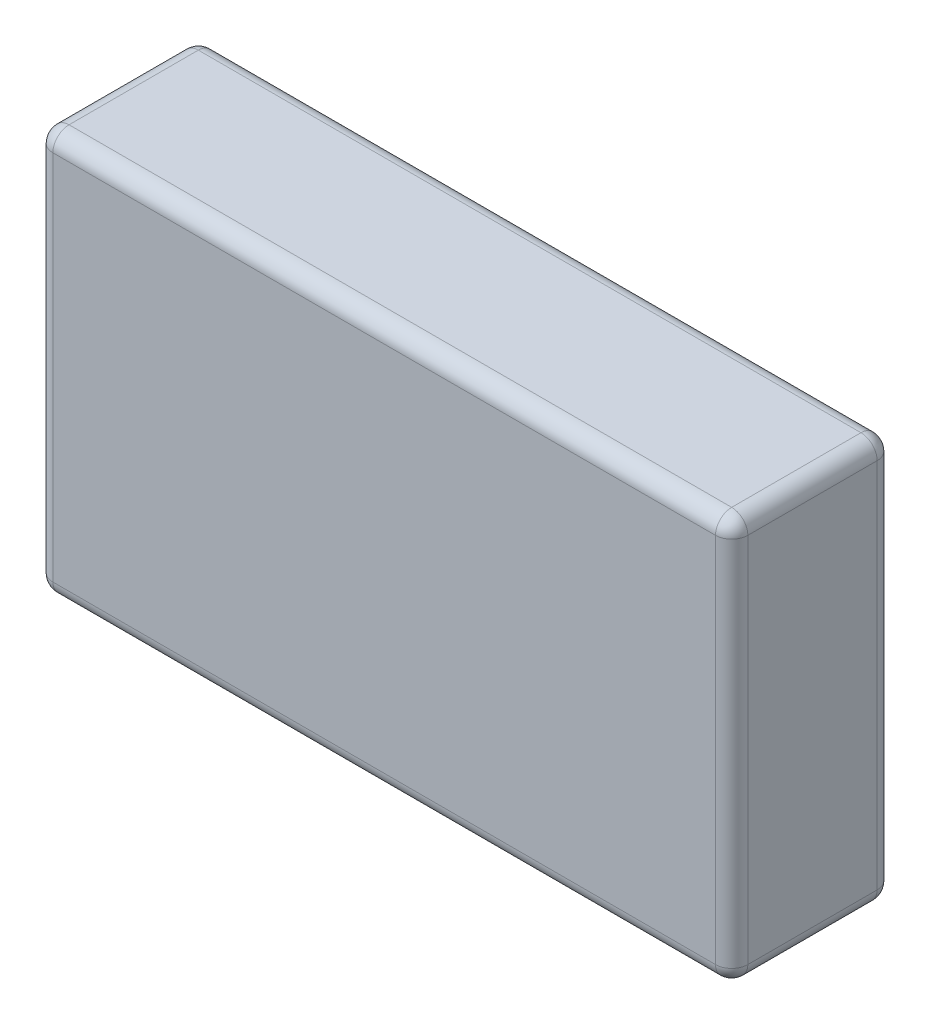
ISO-10303-21;
HEADER;
FILE_DESCRIPTION(('STEP AP214'),'2;1');
FILE_NAME('part.step','',(''),(''),'','','');
FILE_SCHEMA(('AUTOMOTIVE_DESIGN { 1 0 10303 214 1 1 1 1 }'));
ENDSEC;
DATA;
#1=APPLICATION_CONTEXT('core data for automotive mechanical design processes');
#2=APPLICATION_PROTOCOL_DEFINITION('international standard','automotive_design',2000,#1);
#3=PRODUCT_CONTEXT('',#1,'mechanical');
#4=PRODUCT('Part','Part','',(#3));
#5=PRODUCT_RELATED_PRODUCT_CATEGORY('part','',(#4));
#6=PRODUCT_DEFINITION_FORMATION('','',#4);
#7=PRODUCT_DEFINITION_CONTEXT('part definition',#1,'design');
#8=PRODUCT_DEFINITION('design','',#6,#7);
#9=PRODUCT_DEFINITION_SHAPE('','',#8);
#10=(LENGTH_UNIT() NAMED_UNIT(*) SI_UNIT(.MILLI.,.METRE.));
#11=(NAMED_UNIT(*) PLANE_ANGLE_UNIT() SI_UNIT($,.RADIAN.));
#12=(NAMED_UNIT(*) SI_UNIT($,.STERADIAN.) SOLID_ANGLE_UNIT());
#13=UNCERTAINTY_MEASURE_WITH_UNIT(LENGTH_MEASURE(1.E-05),#10,'distance_accuracy_value','');
#14=(GEOMETRIC_REPRESENTATION_CONTEXT(3) GLOBAL_UNCERTAINTY_ASSIGNED_CONTEXT((#13)) GLOBAL_UNIT_ASSIGNED_CONTEXT((#10,
#11,#12)) REPRESENTATION_CONTEXT('',''));
#15=CARTESIAN_POINT('',(0.,0.,0.));
#16=DIRECTION('',(0.,0.,1.));
#17=DIRECTION('',(1.,0.,0.));
#18=AXIS2_PLACEMENT_3D('',#15,#16,#17);
#19=CARTESIAN_POINT('',(21.5,-12.5,10.));
#20=DIRECTION('',(-1.,0.,0.));
#21=DIRECTION('',(0.,0.,1.));
#22=AXIS2_PLACEMENT_3D('',#19,#20,#21);
#23=PLANE('',#22);
#24=DIRECTION('',(0.,1.,0.));
#25=VECTOR('',#24,1.);
#26=CARTESIAN_POINT('',(21.5,12.5,0.999999999999999));
#27=LINE('',#26,#25);
#28=CARTESIAN_POINT('',(21.5,-11.5,0.999999999999999));
#29=VERTEX_POINT('',#28);
#30=CARTESIAN_POINT('',(21.5,11.5,0.999999999999999));
#31=VERTEX_POINT('',#30);
#32=EDGE_CURVE('E181',#29,#31,#27,.T.);
#33=ORIENTED_EDGE('',*,*,#32,.T.);
#34=DIRECTION('',(0.,0.,-1.));
#35=VECTOR('',#34,1.);
#36=CARTESIAN_POINT('',(21.5,11.5,10.));
#37=LINE('',#36,#35);
#38=CARTESIAN_POINT('',(21.5,11.5,9.));
#39=VERTEX_POINT('',#38);
#40=EDGE_CURVE('E183',#31,#39,#37,.F.);
#41=ORIENTED_EDGE('',*,*,#40,.T.);
#42=DIRECTION('',(0.,1.,0.));
#43=VECTOR('',#42,1.);
#44=CARTESIAN_POINT('',(21.5,-12.5,9.));
#45=LINE('',#44,#43);
#46=CARTESIAN_POINT('',(21.5,-11.5,9.));
#47=VERTEX_POINT('',#46);
#48=EDGE_CURVE('E177',#39,#47,#45,.F.);
#49=ORIENTED_EDGE('',*,*,#48,.T.);
#50=DIRECTION('',(0.,0.,-1.));
#51=VECTOR('',#50,1.);
#52=CARTESIAN_POINT('',(21.5,-11.5,10.));
#53=LINE('',#52,#51);
#54=EDGE_CURVE('E179',#47,#29,#53,.T.);
#55=ORIENTED_EDGE('',*,*,#54,.T.);
#56=EDGE_LOOP('',(#33,#41,#49,#55));
#57=FACE_BOUND('',#56,.T.);
#58=ADVANCED_FACE('F37',(#57),#23,.F.);
#59=CARTESIAN_POINT('',(-21.5,12.5,10.));
#60=DIRECTION('',(0.,-1.,0.));
#61=DIRECTION('',(0.,0.,-1.));
#62=AXIS2_PLACEMENT_3D('',#59,#60,#61);
#63=PLANE('',#62);
#64=DIRECTION('',(0.,0.,-1.));
#65=VECTOR('',#64,1.);
#66=CARTESIAN_POINT('',(20.5,12.5,10.));
#67=LINE('',#66,#65);
#68=CARTESIAN_POINT('',(20.5,12.5,9.));
#69=VERTEX_POINT('',#68);
#70=CARTESIAN_POINT('',(20.5,12.5,0.999999999999999));
#71=VERTEX_POINT('',#70);
#72=EDGE_CURVE('E170',#69,#71,#67,.T.);
#73=ORIENTED_EDGE('',*,*,#72,.T.);
#74=DIRECTION('',(-1.,0.,0.));
#75=VECTOR('',#74,1.);
#76=CARTESIAN_POINT('',(-21.5,12.5,0.999999999999999));
#77=LINE('',#76,#75);
#78=CARTESIAN_POINT('',(-20.5,12.5,0.999999999999999));
#79=VERTEX_POINT('',#78);
#80=EDGE_CURVE('E175',#71,#79,#77,.T.);
#81=ORIENTED_EDGE('',*,*,#80,.T.);
#82=DIRECTION('',(0.,0.,-1.));
#83=VECTOR('',#82,1.);
#84=CARTESIAN_POINT('',(-20.5,12.5,10.));
#85=LINE('',#84,#83);
#86=CARTESIAN_POINT('',(-20.5,12.5,9.));
#87=VERTEX_POINT('',#86);
#88=EDGE_CURVE('E172',#79,#87,#85,.F.);
#89=ORIENTED_EDGE('',*,*,#88,.T.);
#90=DIRECTION('',(-1.,0.,0.));
#91=VECTOR('',#90,1.);
#92=CARTESIAN_POINT('',(-21.5,12.5,9.));
#93=LINE('',#92,#91);
#94=EDGE_CURVE('E168',#87,#69,#93,.F.);
#95=ORIENTED_EDGE('',*,*,#94,.T.);
#96=EDGE_LOOP('',(#73,#81,#89,#95));
#97=FACE_BOUND('',#96,.T.);
#98=ADVANCED_FACE('F308',(#97),#63,.F.);
#99=CARTESIAN_POINT('',(-21.5,-12.5,10.));
#100=DIRECTION('',(1.,0.,0.));
#101=DIRECTION('',(0.,0.,-1.));
#102=AXIS2_PLACEMENT_3D('',#99,#100,#101);
#103=PLANE('',#102);
#104=DIRECTION('',(0.,-1.,0.));
#105=VECTOR('',#104,1.);
#106=CARTESIAN_POINT('',(-21.5,-12.5,9.));
#107=LINE('',#106,#105);
#108=CARTESIAN_POINT('',(-21.5,-11.5,9.));
#109=VERTEX_POINT('',#108);
#110=CARTESIAN_POINT('',(-21.5,11.5,9.));
#111=VERTEX_POINT('',#110);
#112=EDGE_CURVE('E129',#109,#111,#107,.F.);
#113=ORIENTED_EDGE('',*,*,#112,.T.);
#114=DIRECTION('',(0.,0.,-1.));
#115=VECTOR('',#114,1.);
#116=CARTESIAN_POINT('',(-21.5,11.5,10.));
#117=LINE('',#116,#115);
#118=CARTESIAN_POINT('',(-21.5,11.5,0.999999999999999));
#119=VERTEX_POINT('',#118);
#120=EDGE_CURVE('E166',#111,#119,#117,.T.);
#121=ORIENTED_EDGE('',*,*,#120,.T.);
#122=DIRECTION('',(0.,-1.,0.));
#123=VECTOR('',#122,1.);
#124=CARTESIAN_POINT('',(-21.5,-12.5,0.999999999999999));
#125=LINE('',#124,#123);
#126=CARTESIAN_POINT('',(-21.5,-11.5,0.999999999999999));
#127=VERTEX_POINT('',#126);
#128=EDGE_CURVE('E132',#119,#127,#125,.T.);
#129=ORIENTED_EDGE('',*,*,#128,.T.);
#130=DIRECTION('',(0.,0.,-1.));
#131=VECTOR('',#130,1.);
#132=CARTESIAN_POINT('',(-21.5,-11.5,10.));
#133=LINE('',#132,#131);
#134=EDGE_CURVE('E124',#127,#109,#133,.F.);
#135=ORIENTED_EDGE('',*,*,#134,.T.);
#136=EDGE_LOOP('',(#113,#121,#129,#135));
#137=FACE_BOUND('',#136,.T.);
#138=ADVANCED_FACE('F126',(#137),#103,.F.);
#139=CARTESIAN_POINT('',(-21.5,-12.5,10.));
#140=DIRECTION('',(0.,1.,0.));
#141=DIRECTION('',(0.,0.,1.));
#142=AXIS2_PLACEMENT_3D('',#139,#140,#141);
#143=PLANE('',#142);
#144=DIRECTION('',(0.,0.,-1.));
#145=VECTOR('',#144,1.);
#146=CARTESIAN_POINT('',(-20.5,-12.5,10.));
#147=LINE('',#146,#145);
#148=CARTESIAN_POINT('',(-20.5,-12.5,9.));
#149=VERTEX_POINT('',#148);
#150=CARTESIAN_POINT('',(-20.5,-12.5,0.999999999999999));
#151=VERTEX_POINT('',#150);
#152=EDGE_CURVE('E143',#149,#151,#147,.T.);
#153=ORIENTED_EDGE('',*,*,#152,.T.);
#154=DIRECTION('',(1.,0.,0.));
#155=VECTOR('',#154,1.);
#156=CARTESIAN_POINT('',(21.5,-12.5,0.999999999999999));
#157=LINE('',#156,#155);
#158=CARTESIAN_POINT('',(20.5,-12.5,0.999999999999999));
#159=VERTEX_POINT('',#158);
#160=EDGE_CURVE('E200',#151,#159,#157,.T.);
#161=ORIENTED_EDGE('',*,*,#160,.T.);
#162=DIRECTION('',(0.,0.,-1.));
#163=VECTOR('',#162,1.);
#164=CARTESIAN_POINT('',(20.5,-12.5,10.));
#165=LINE('',#164,#163);
#166=CARTESIAN_POINT('',(20.5,-12.5,9.));
#167=VERTEX_POINT('',#166);
#168=EDGE_CURVE('E197',#159,#167,#165,.F.);
#169=ORIENTED_EDGE('',*,*,#168,.T.);
#170=DIRECTION('',(1.,0.,0.));
#171=VECTOR('',#170,1.);
#172=CARTESIAN_POINT('',(-21.5,-12.5,9.));
#173=LINE('',#172,#171);
#174=EDGE_CURVE('E195',#167,#149,#173,.F.);
#175=ORIENTED_EDGE('',*,*,#174,.T.);
#176=EDGE_LOOP('',(#153,#161,#169,#175));
#177=FACE_BOUND('',#176,.T.);
#178=ADVANCED_FACE('F299',(#177),#143,.F.);
#179=CARTESIAN_POINT('',(0.,0.,10.));
#180=DIRECTION('',(0.,0.,-1.));
#181=DIRECTION('',(-1.,0.,0.));
#182=AXIS2_PLACEMENT_3D('',#179,#180,#181);
#183=PLANE('',#182);
#184=DIRECTION('',(0.,-1.,0.));
#185=VECTOR('',#184,1.);
#186=CARTESIAN_POINT('',(-20.5,0.,10.));
#187=LINE('',#186,#185);
#188=CARTESIAN_POINT('',(-20.5,11.5,10.));
#189=VERTEX_POINT('',#188);
#190=CARTESIAN_POINT('',(-20.5,-11.5,10.));
#191=VERTEX_POINT('',#190);
#192=EDGE_CURVE('E46',#189,#191,#187,.T.);
#193=ORIENTED_EDGE('',*,*,#192,.T.);
#194=DIRECTION('',(1.,0.,0.));
#195=VECTOR('',#194,1.);
#196=CARTESIAN_POINT('',(0.,-11.5,10.));
#197=LINE('',#196,#195);
#198=CARTESIAN_POINT('',(20.5,-11.5,10.));
#199=VERTEX_POINT('',#198);
#200=EDGE_CURVE('E11',#191,#199,#197,.T.);
#201=ORIENTED_EDGE('',*,*,#200,.T.);
#202=DIRECTION('',(0.,1.,0.));
#203=VECTOR('',#202,1.);
#204=CARTESIAN_POINT('',(20.5,0.,10.));
#205=LINE('',#204,#203);
#206=CARTESIAN_POINT('',(20.5,11.5,10.));
#207=VERTEX_POINT('',#206);
#208=EDGE_CURVE('E202',#199,#207,#205,.T.);
#209=ORIENTED_EDGE('',*,*,#208,.T.);
#210=DIRECTION('',(-1.,0.,0.));
#211=VECTOR('',#210,1.);
#212=CARTESIAN_POINT('',(0.,11.5,10.));
#213=LINE('',#212,#211);
#214=EDGE_CURVE('E57',#207,#189,#213,.T.);
#215=ORIENTED_EDGE('',*,*,#214,.T.);
#216=EDGE_LOOP('',(#193,#201,#209,#215));
#217=FACE_BOUND('',#216,.T.);
#218=ADVANCED_FACE('F301',(#217),#183,.F.);
#219=CARTESIAN_POINT('',(0.,0.,0.));
#220=DIRECTION('',(0.,0.,-1.));
#221=DIRECTION('',(-1.,0.,0.));
#222=AXIS2_PLACEMENT_3D('',#219,#220,#221);
#223=PLANE('',#222);
#224=DIRECTION('',(0.,-1.,0.));
#225=VECTOR('',#224,1.);
#226=CARTESIAN_POINT('',(-20.5,12.5,0.));
#227=LINE('',#226,#225);
#228=CARTESIAN_POINT('',(-20.5,-11.5,0.));
#229=VERTEX_POINT('',#228);
#230=CARTESIAN_POINT('',(-20.5,11.5,0.));
#231=VERTEX_POINT('',#230);
#232=EDGE_CURVE('E190',#229,#231,#227,.F.);
#233=ORIENTED_EDGE('',*,*,#232,.T.);
#234=DIRECTION('',(-1.,0.,0.));
#235=VECTOR('',#234,1.);
#236=CARTESIAN_POINT('',(21.5,11.5,0.));
#237=LINE('',#236,#235);
#238=CARTESIAN_POINT('',(20.5,11.5,0.));
#239=VERTEX_POINT('',#238);
#240=EDGE_CURVE('E192',#231,#239,#237,.F.);
#241=ORIENTED_EDGE('',*,*,#240,.T.);
#242=DIRECTION('',(0.,1.,0.));
#243=VECTOR('',#242,1.);
#244=CARTESIAN_POINT('',(20.5,-12.5,0.));
#245=LINE('',#244,#243);
#246=CARTESIAN_POINT('',(20.5,-11.5,0.));
#247=VERTEX_POINT('',#246);
#248=EDGE_CURVE('E188',#239,#247,#245,.F.);
#249=ORIENTED_EDGE('',*,*,#248,.T.);
#250=DIRECTION('',(1.,0.,0.));
#251=VECTOR('',#250,1.);
#252=CARTESIAN_POINT('',(-21.5,-11.5,0.));
#253=LINE('',#252,#251);
#254=EDGE_CURVE('E186',#247,#229,#253,.F.);
#255=ORIENTED_EDGE('',*,*,#254,.T.);
#256=EDGE_LOOP('',(#233,#241,#249,#255));
#257=FACE_BOUND('',#256,.T.);
#258=ADVANCED_FACE('F269',(#257),#223,.T.);
#259=CARTESIAN_POINT('',(20.5,-11.5,10.));
#260=DIRECTION('',(0.,0.,-1.));
#261=DIRECTION('',(-1.,0.,0.));
#262=AXIS2_PLACEMENT_3D('',#259,#260,#261);
#263=CYLINDRICAL_SURFACE('',#262,1.);
#264=CARTESIAN_POINT('',(20.5,-11.5,9.));
#265=DIRECTION('',(0.,0.,1.));
#266=DIRECTION('',(1.,0.,0.));
#267=AXIS2_PLACEMENT_3D('',#264,#265,#266);
#268=CIRCLE('',#267,1.);
#269=EDGE_CURVE('E41',#167,#47,#268,.T.);
#270=ORIENTED_EDGE('',*,*,#269,.F.);
#271=ORIENTED_EDGE('',*,*,#168,.F.);
#272=CARTESIAN_POINT('',(20.5,-11.5,0.999999999999999));
#273=DIRECTION('',(0.,0.,-1.));
#274=DIRECTION('',(-1.,0.,0.));
#275=AXIS2_PLACEMENT_3D('',#272,#273,#274);
#276=CIRCLE('',#275,1.);
#277=EDGE_CURVE('E163',#29,#159,#276,.T.);
#278=ORIENTED_EDGE('',*,*,#277,.F.);
#279=ORIENTED_EDGE('',*,*,#54,.F.);
#280=EDGE_LOOP('',(#270,#271,#278,#279));
#281=FACE_BOUND('',#280,.T.);
#282=ADVANCED_FACE('F39',(#281),#263,.T.);
#283=CARTESIAN_POINT('',(20.5,-11.5,9.));
#284=DIRECTION('',(0.,0.,1.));
#285=DIRECTION('',(1.,0.,0.));
#286=AXIS2_PLACEMENT_3D('',#283,#284,#285);
#287=SPHERICAL_SURFACE('',#286,1.);
#288=CARTESIAN_POINT('',(20.5,-11.5,9.));
#289=DIRECTION('',(1.,0.,0.));
#290=DIRECTION('',(0.,0.,-1.));
#291=AXIS2_PLACEMENT_3D('',#288,#289,#290);
#292=CIRCLE('',#291,1.);
#293=EDGE_CURVE('E247',#167,#199,#292,.F.);
#294=ORIENTED_EDGE('',*,*,#293,.F.);
#295=ORIENTED_EDGE('',*,*,#269,.T.);
#296=CARTESIAN_POINT('',(20.5,-11.5,9.));
#297=DIRECTION('',(0.,-1.,0.));
#298=DIRECTION('',(0.,0.,-1.));
#299=AXIS2_PLACEMENT_3D('',#296,#297,#298);
#300=CIRCLE('',#299,1.);
#301=EDGE_CURVE('E250',#199,#47,#300,.F.);
#302=ORIENTED_EDGE('',*,*,#301,.F.);
#303=EDGE_LOOP('',(#294,#295,#302));
#304=FACE_BOUND('',#303,.T.);
#305=ADVANCED_FACE('F294',(#304),#287,.T.);
#306=CARTESIAN_POINT('',(20.5,-11.5,1.));
#307=DIRECTION('',(0.,0.,1.));
#308=DIRECTION('',(1.,0.,0.));
#309=AXIS2_PLACEMENT_3D('',#306,#307,#308);
#310=SPHERICAL_SURFACE('',#309,1.);
#311=CARTESIAN_POINT('',(20.5,-11.5,1.));
#312=DIRECTION('',(0.,-1.,0.));
#313=DIRECTION('',(0.,0.,-1.));
#314=AXIS2_PLACEMENT_3D('',#311,#312,#313);
#315=CIRCLE('',#314,1.);
#316=EDGE_CURVE('E241',#29,#247,#315,.F.);
#317=ORIENTED_EDGE('',*,*,#316,.F.);
#318=ORIENTED_EDGE('',*,*,#277,.T.);
#319=CARTESIAN_POINT('',(20.5,-11.5,0.999999999999999));
#320=DIRECTION('',(1.,0.,0.));
#321=DIRECTION('',(0.,0.,-1.));
#322=AXIS2_PLACEMENT_3D('',#319,#320,#321);
#323=CIRCLE('',#322,1.);
#324=EDGE_CURVE('E244',#247,#159,#323,.F.);
#325=ORIENTED_EDGE('',*,*,#324,.F.);
#326=EDGE_LOOP('',(#317,#318,#325));
#327=FACE_BOUND('',#326,.T.);
#328=ADVANCED_FACE('F257',(#327),#310,.T.);
#329=CARTESIAN_POINT('',(20.5,0.,9.));
#330=DIRECTION('',(0.,1.,0.));
#331=DIRECTION('',(0.,0.,1.));
#332=AXIS2_PLACEMENT_3D('',#329,#330,#331);
#333=CYLINDRICAL_SURFACE('',#332,1.);
#334=ORIENTED_EDGE('',*,*,#301,.T.);
#335=ORIENTED_EDGE('',*,*,#48,.F.);
#336=CARTESIAN_POINT('',(20.5,11.5,9.));
#337=DIRECTION('',(0.,1.,0.));
#338=DIRECTION('',(0.,0.,1.));
#339=AXIS2_PLACEMENT_3D('',#336,#337,#338);
#340=CIRCLE('',#339,1.);
#341=EDGE_CURVE('E236',#207,#39,#340,.T.);
#342=ORIENTED_EDGE('',*,*,#341,.F.);
#343=ORIENTED_EDGE('',*,*,#208,.F.);
#344=EDGE_LOOP('',(#334,#335,#342,#343));
#345=FACE_BOUND('',#344,.T.);
#346=ADVANCED_FACE('F289',(#345),#333,.T.);
#347=CARTESIAN_POINT('',(0.,-11.5,9.));
#348=DIRECTION('',(1.,0.,0.));
#349=DIRECTION('',(0.,0.,-1.));
#350=AXIS2_PLACEMENT_3D('',#347,#348,#349);
#351=CYLINDRICAL_SURFACE('',#350,1.);
#352=ORIENTED_EDGE('',*,*,#293,.T.);
#353=ORIENTED_EDGE('',*,*,#200,.F.);
#354=CARTESIAN_POINT('',(-20.5,-11.5,9.));
#355=DIRECTION('',(-1.,0.,0.));
#356=DIRECTION('',(0.,0.,1.));
#357=AXIS2_PLACEMENT_3D('',#354,#355,#356);
#358=CIRCLE('',#357,1.);
#359=EDGE_CURVE('E147',#149,#191,#358,.T.);
#360=ORIENTED_EDGE('',*,*,#359,.F.);
#361=ORIENTED_EDGE('',*,*,#174,.F.);
#362=EDGE_LOOP('',(#352,#353,#360,#361));
#363=FACE_BOUND('',#362,.T.);
#364=ADVANCED_FACE('F297',(#363),#351,.T.);
#365=CARTESIAN_POINT('',(-20.5,-11.5,10.));
#366=DIRECTION('',(0.,0.,-1.));
#367=DIRECTION('',(-1.,0.,0.));
#368=AXIS2_PLACEMENT_3D('',#365,#366,#367);
#369=CYLINDRICAL_SURFACE('',#368,1.);
#370=CARTESIAN_POINT('',(-20.5,-11.5,0.999999999999999));
#371=DIRECTION('',(0.,0.,-1.));
#372=DIRECTION('',(-1.,0.,0.));
#373=AXIS2_PLACEMENT_3D('',#370,#371,#372);
#374=CIRCLE('',#373,1.);
#375=EDGE_CURVE('E148',#151,#127,#374,.T.);
#376=ORIENTED_EDGE('',*,*,#375,.F.);
#377=ORIENTED_EDGE('',*,*,#152,.F.);
#378=CARTESIAN_POINT('',(-20.5,-11.5,9.));
#379=DIRECTION('',(0.,0.,1.));
#380=DIRECTION('',(1.,0.,0.));
#381=AXIS2_PLACEMENT_3D('',#378,#379,#380);
#382=CIRCLE('',#381,1.);
#383=EDGE_CURVE('E139',#109,#149,#382,.T.);
#384=ORIENTED_EDGE('',*,*,#383,.F.);
#385=ORIENTED_EDGE('',*,*,#134,.F.);
#386=EDGE_LOOP('',(#376,#377,#384,#385));
#387=FACE_BOUND('',#386,.T.);
#388=ADVANCED_FACE('F141',(#387),#369,.T.);
#389=CARTESIAN_POINT('',(-21.5,-11.5,0.999999999999999));
#390=DIRECTION('',(-1.,0.,0.));
#391=DIRECTION('',(0.,0.,1.));
#392=AXIS2_PLACEMENT_3D('',#389,#390,#391);
#393=CYLINDRICAL_SURFACE('',#392,1.);
#394=ORIENTED_EDGE('',*,*,#324,.T.);
#395=ORIENTED_EDGE('',*,*,#160,.F.);
#396=CARTESIAN_POINT('',(-20.5,-11.5,1.));
#397=DIRECTION('',(-1.,0.,0.));
#398=DIRECTION('',(0.,0.,1.));
#399=AXIS2_PLACEMENT_3D('',#396,#397,#398);
#400=CIRCLE('',#399,1.);
#401=EDGE_CURVE('E232',#229,#151,#400,.T.);
#402=ORIENTED_EDGE('',*,*,#401,.F.);
#403=ORIENTED_EDGE('',*,*,#254,.F.);
#404=EDGE_LOOP('',(#394,#395,#402,#403));
#405=FACE_BOUND('',#404,.T.);
#406=ADVANCED_FACE('F265',(#405),#393,.T.);
#407=CARTESIAN_POINT('',(20.5,-12.5,0.999999999999999));
#408=DIRECTION('',(0.,-1.,0.));
#409=DIRECTION('',(0.,0.,-1.));
#410=AXIS2_PLACEMENT_3D('',#407,#408,#409);
#411=CYLINDRICAL_SURFACE('',#410,1.);
#412=ORIENTED_EDGE('',*,*,#316,.T.);
#413=ORIENTED_EDGE('',*,*,#248,.F.);
#414=CARTESIAN_POINT('',(20.5,11.5,0.999999999999999));
#415=DIRECTION('',(0.,1.,0.));
#416=DIRECTION('',(0.,0.,1.));
#417=AXIS2_PLACEMENT_3D('',#414,#415,#416);
#418=CIRCLE('',#417,1.);
#419=EDGE_CURVE('E229',#31,#239,#418,.T.);
#420=ORIENTED_EDGE('',*,*,#419,.F.);
#421=ORIENTED_EDGE('',*,*,#32,.F.);
#422=EDGE_LOOP('',(#412,#413,#420,#421));
#423=FACE_BOUND('',#422,.T.);
#424=ADVANCED_FACE('F275',(#423),#411,.T.);
#425=CARTESIAN_POINT('',(20.5,11.5,10.));
#426=DIRECTION('',(0.,0.,-1.));
#427=DIRECTION('',(-1.,0.,0.));
#428=AXIS2_PLACEMENT_3D('',#425,#426,#427);
#429=CYLINDRICAL_SURFACE('',#428,1.);
#430=CARTESIAN_POINT('',(20.5,11.5,9.));
#431=DIRECTION('',(0.,0.,1.));
#432=DIRECTION('',(1.,0.,0.));
#433=AXIS2_PLACEMENT_3D('',#430,#431,#432);
#434=CIRCLE('',#433,1.);
#435=EDGE_CURVE('E238',#39,#69,#434,.T.);
#436=ORIENTED_EDGE('',*,*,#435,.F.);
#437=ORIENTED_EDGE('',*,*,#40,.F.);
#438=CARTESIAN_POINT('',(20.5,11.5,0.999999999999999));
#439=DIRECTION('',(0.,0.,-1.));
#440=DIRECTION('',(-1.,0.,0.));
#441=AXIS2_PLACEMENT_3D('',#438,#439,#440);
#442=CIRCLE('',#441,1.);
#443=EDGE_CURVE('E226',#71,#31,#442,.T.);
#444=ORIENTED_EDGE('',*,*,#443,.F.);
#445=ORIENTED_EDGE('',*,*,#72,.F.);
#446=EDGE_LOOP('',(#436,#437,#444,#445));
#447=FACE_BOUND('',#446,.T.);
#448=ADVANCED_FACE('F281',(#447),#429,.T.);
#449=CARTESIAN_POINT('',(20.5,11.5,9.));
#450=DIRECTION('',(0.,0.,1.));
#451=DIRECTION('',(1.,0.,0.));
#452=AXIS2_PLACEMENT_3D('',#449,#450,#451);
#453=SPHERICAL_SURFACE('',#452,1.);
#454=ORIENTED_EDGE('',*,*,#341,.T.);
#455=ORIENTED_EDGE('',*,*,#435,.T.);
#456=CARTESIAN_POINT('',(20.5,11.5,9.));
#457=DIRECTION('',(1.,0.,0.));
#458=DIRECTION('',(0.,0.,-1.));
#459=AXIS2_PLACEMENT_3D('',#456,#457,#458);
#460=CIRCLE('',#459,1.);
#461=EDGE_CURVE('E154',#207,#69,#460,.F.);
#462=ORIENTED_EDGE('',*,*,#461,.F.);
#463=EDGE_LOOP('',(#454,#455,#462));
#464=FACE_BOUND('',#463,.T.);
#465=ADVANCED_FACE('F355',(#464),#453,.T.);
#466=CARTESIAN_POINT('',(-20.5,-11.5,9.));
#467=DIRECTION('',(0.,0.,1.));
#468=DIRECTION('',(1.,0.,0.));
#469=AXIS2_PLACEMENT_3D('',#466,#467,#468);
#470=SPHERICAL_SURFACE('',#469,1.);
#471=ORIENTED_EDGE('',*,*,#383,.T.);
#472=ORIENTED_EDGE('',*,*,#359,.T.);
#473=CARTESIAN_POINT('',(-20.5,-11.5,9.));
#474=DIRECTION('',(0.,-1.,0.));
#475=DIRECTION('',(0.,0.,-1.));
#476=AXIS2_PLACEMENT_3D('',#473,#474,#475);
#477=CIRCLE('',#476,1.);
#478=EDGE_CURVE('E151',#109,#191,#477,.F.);
#479=ORIENTED_EDGE('',*,*,#478,.F.);
#480=EDGE_LOOP('',(#471,#472,#479));
#481=FACE_BOUND('',#480,.T.);
#482=ADVANCED_FACE('F152',(#481),#470,.T.);
#483=CARTESIAN_POINT('',(-20.5,-11.5,1.));
#484=DIRECTION('',(0.,0.,1.));
#485=DIRECTION('',(1.,0.,0.));
#486=AXIS2_PLACEMENT_3D('',#483,#484,#485);
#487=SPHERICAL_SURFACE('',#486,1.);
#488=ORIENTED_EDGE('',*,*,#401,.T.);
#489=ORIENTED_EDGE('',*,*,#375,.T.);
#490=CARTESIAN_POINT('',(-20.5,-11.5,0.999999999999999));
#491=DIRECTION('',(0.,-1.,0.));
#492=DIRECTION('',(0.,0.,-1.));
#493=AXIS2_PLACEMENT_3D('',#490,#491,#492);
#494=CIRCLE('',#493,1.);
#495=EDGE_CURVE('E155',#229,#127,#494,.F.);
#496=ORIENTED_EDGE('',*,*,#495,.F.);
#497=EDGE_LOOP('',(#488,#489,#496));
#498=FACE_BOUND('',#497,.T.);
#499=ADVANCED_FACE('F348',(#498),#487,.T.);
#500=CARTESIAN_POINT('',(20.5,11.5,1.));
#501=DIRECTION('',(0.,0.,1.));
#502=DIRECTION('',(1.,0.,0.));
#503=AXIS2_PLACEMENT_3D('',#500,#501,#502);
#504=SPHERICAL_SURFACE('',#503,1.);
#505=ORIENTED_EDGE('',*,*,#443,.T.);
#506=ORIENTED_EDGE('',*,*,#419,.T.);
#507=CARTESIAN_POINT('',(20.5,11.5,1.));
#508=DIRECTION('',(1.,0.,0.));
#509=DIRECTION('',(0.,0.,-1.));
#510=AXIS2_PLACEMENT_3D('',#507,#508,#509);
#511=CIRCLE('',#510,1.);
#512=EDGE_CURVE('E220',#71,#239,#511,.F.);
#513=ORIENTED_EDGE('',*,*,#512,.F.);
#514=EDGE_LOOP('',(#505,#506,#513));
#515=FACE_BOUND('',#514,.T.);
#516=ADVANCED_FACE('F344',(#515),#504,.T.);
#517=CARTESIAN_POINT('',(0.,11.5,9.));
#518=DIRECTION('',(-1.,0.,0.));
#519=DIRECTION('',(0.,0.,1.));
#520=AXIS2_PLACEMENT_3D('',#517,#518,#519);
#521=CYLINDRICAL_SURFACE('',#520,1.);
#522=ORIENTED_EDGE('',*,*,#461,.T.);
#523=ORIENTED_EDGE('',*,*,#94,.F.);
#524=CARTESIAN_POINT('',(-20.5,11.5,9.));
#525=DIRECTION('',(-1.,0.,0.));
#526=DIRECTION('',(0.,0.,1.));
#527=AXIS2_PLACEMENT_3D('',#524,#525,#526);
#528=CIRCLE('',#527,1.);
#529=EDGE_CURVE('E217',#189,#87,#528,.T.);
#530=ORIENTED_EDGE('',*,*,#529,.F.);
#531=ORIENTED_EDGE('',*,*,#214,.F.);
#532=EDGE_LOOP('',(#522,#523,#530,#531));
#533=FACE_BOUND('',#532,.T.);
#534=ADVANCED_FACE('F341',(#533),#521,.T.);
#535=CARTESIAN_POINT('',(-20.5,0.,9.));
#536=DIRECTION('',(0.,-1.,0.));
#537=DIRECTION('',(0.,0.,-1.));
#538=AXIS2_PLACEMENT_3D('',#535,#536,#537);
#539=CYLINDRICAL_SURFACE('',#538,1.);
#540=ORIENTED_EDGE('',*,*,#478,.T.);
#541=ORIENTED_EDGE('',*,*,#192,.F.);
#542=CARTESIAN_POINT('',(-20.5,11.5,9.));
#543=DIRECTION('',(0.,1.,0.));
#544=DIRECTION('',(0.,0.,1.));
#545=AXIS2_PLACEMENT_3D('',#542,#543,#544);
#546=CIRCLE('',#545,1.);
#547=EDGE_CURVE('E159',#111,#189,#546,.T.);
#548=ORIENTED_EDGE('',*,*,#547,.F.);
#549=ORIENTED_EDGE('',*,*,#112,.F.);
#550=EDGE_LOOP('',(#540,#541,#548,#549));
#551=FACE_BOUND('',#550,.T.);
#552=ADVANCED_FACE('F157',(#551),#539,.T.);
#553=CARTESIAN_POINT('',(-20.5,-12.5,0.999999999999999));
#554=DIRECTION('',(0.,1.,0.));
#555=DIRECTION('',(0.,0.,1.));
#556=AXIS2_PLACEMENT_3D('',#553,#554,#555);
#557=CYLINDRICAL_SURFACE('',#556,1.);
#558=ORIENTED_EDGE('',*,*,#495,.T.);
#559=ORIENTED_EDGE('',*,*,#128,.F.);
#560=CARTESIAN_POINT('',(-20.5,11.5,1.));
#561=DIRECTION('',(0.,1.,0.));
#562=DIRECTION('',(0.,0.,1.));
#563=AXIS2_PLACEMENT_3D('',#560,#561,#562);
#564=CIRCLE('',#563,1.);
#565=EDGE_CURVE('E213',#231,#119,#564,.T.);
#566=ORIENTED_EDGE('',*,*,#565,.F.);
#567=ORIENTED_EDGE('',*,*,#232,.F.);
#568=EDGE_LOOP('',(#558,#559,#566,#567));
#569=FACE_BOUND('',#568,.T.);
#570=ADVANCED_FACE('F334',(#569),#557,.T.);
#571=CARTESIAN_POINT('',(-21.5,11.5,0.999999999999999));
#572=DIRECTION('',(1.,0.,0.));
#573=DIRECTION('',(0.,0.,-1.));
#574=AXIS2_PLACEMENT_3D('',#571,#572,#573);
#575=CYLINDRICAL_SURFACE('',#574,1.);
#576=ORIENTED_EDGE('',*,*,#512,.T.);
#577=ORIENTED_EDGE('',*,*,#240,.F.);
#578=CARTESIAN_POINT('',(-20.5,11.5,0.999999999999999));
#579=DIRECTION('',(-1.,0.,0.));
#580=DIRECTION('',(0.,0.,1.));
#581=AXIS2_PLACEMENT_3D('',#578,#579,#580);
#582=CIRCLE('',#581,1.);
#583=EDGE_CURVE('E210',#79,#231,#582,.T.);
#584=ORIENTED_EDGE('',*,*,#583,.F.);
#585=ORIENTED_EDGE('',*,*,#80,.F.);
#586=EDGE_LOOP('',(#576,#577,#584,#585));
#587=FACE_BOUND('',#586,.T.);
#588=ADVANCED_FACE('F330',(#587),#575,.T.);
#589=CARTESIAN_POINT('',(-20.5,11.5,9.));
#590=DIRECTION('',(0.,0.,1.));
#591=DIRECTION('',(1.,0.,0.));
#592=AXIS2_PLACEMENT_3D('',#589,#590,#591);
#593=SPHERICAL_SURFACE('',#592,1.);
#594=ORIENTED_EDGE('',*,*,#547,.T.);
#595=ORIENTED_EDGE('',*,*,#529,.T.);
#596=CARTESIAN_POINT('',(-20.5,11.5,9.));
#597=DIRECTION('',(0.,0.,1.));
#598=DIRECTION('',(1.,0.,0.));
#599=AXIS2_PLACEMENT_3D('',#596,#597,#598);
#600=CIRCLE('',#599,1.);
#601=EDGE_CURVE('E208',#111,#87,#600,.F.);
#602=ORIENTED_EDGE('',*,*,#601,.F.);
#603=EDGE_LOOP('',(#594,#595,#602));
#604=FACE_BOUND('',#603,.T.);
#605=ADVANCED_FACE('F326',(#604),#593,.T.);
#606=CARTESIAN_POINT('',(-20.5,11.5,1.));
#607=DIRECTION('',(0.,0.,1.));
#608=DIRECTION('',(1.,0.,0.));
#609=AXIS2_PLACEMENT_3D('',#606,#607,#608);
#610=SPHERICAL_SURFACE('',#609,1.);
#611=ORIENTED_EDGE('',*,*,#583,.T.);
#612=ORIENTED_EDGE('',*,*,#565,.T.);
#613=CARTESIAN_POINT('',(-20.5,11.5,0.999999999999999));
#614=DIRECTION('',(0.,0.,-1.));
#615=DIRECTION('',(-1.,0.,0.));
#616=AXIS2_PLACEMENT_3D('',#613,#614,#615);
#617=CIRCLE('',#616,1.);
#618=EDGE_CURVE('E206',#79,#119,#617,.F.);
#619=ORIENTED_EDGE('',*,*,#618,.F.);
#620=EDGE_LOOP('',(#611,#612,#619));
#621=FACE_BOUND('',#620,.T.);
#622=ADVANCED_FACE('F322',(#621),#610,.T.);
#623=CARTESIAN_POINT('',(-20.5,11.5,10.));
#624=DIRECTION('',(0.,0.,-1.));
#625=DIRECTION('',(-1.,0.,0.));
#626=AXIS2_PLACEMENT_3D('',#623,#624,#625);
#627=CYLINDRICAL_SURFACE('',#626,1.);
#628=ORIENTED_EDGE('',*,*,#601,.T.);
#629=ORIENTED_EDGE('',*,*,#88,.F.);
#630=ORIENTED_EDGE('',*,*,#618,.T.);
#631=ORIENTED_EDGE('',*,*,#120,.F.);
#632=EDGE_LOOP('',(#628,#629,#630,#631));
#633=FACE_BOUND('',#632,.T.);
#634=ADVANCED_FACE('F319',(#633),#627,.T.);
#635=CLOSED_SHELL('',(#58,#98,#138,#178,#218,#258,#282,#305,#328,#346,#364,#388,#406,#424,#448,
#465,#482,#499,#516,#534,#552,#570,#588,#605,#622,#634));
#636=MANIFOLD_SOLID_BREP('B2',#635);
#637=ADVANCED_BREP_SHAPE_REPRESENTATION('',(#18,#636),#14);
#638=SHAPE_DEFINITION_REPRESENTATION(#9,#637);
ENDSEC;
END-ISO-10303-21;
